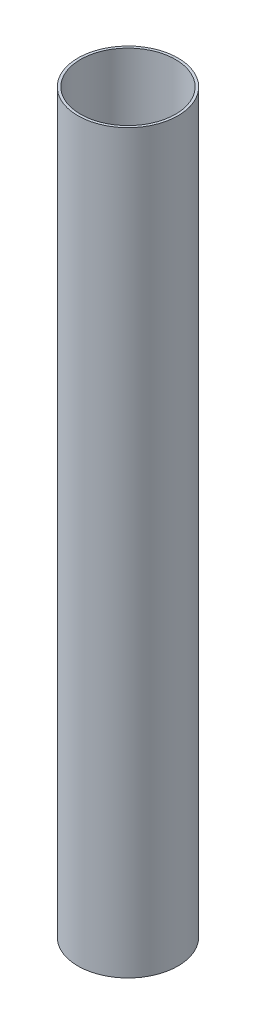
ISO-10303-21;
HEADER;
FILE_DESCRIPTION(('STEP AP214'),'2;1');
FILE_NAME('part.step','',(''),(''),'','','');
FILE_SCHEMA(('AUTOMOTIVE_DESIGN { 1 0 10303 214 1 1 1 1 }'));
ENDSEC;
DATA;
#1=APPLICATION_CONTEXT('core data for automotive mechanical design processes');
#2=APPLICATION_PROTOCOL_DEFINITION('international standard','automotive_design',2000,#1);
#3=PRODUCT_CONTEXT('',#1,'mechanical');
#4=PRODUCT('Part','Part','',(#3));
#5=PRODUCT_RELATED_PRODUCT_CATEGORY('part','',(#4));
#6=PRODUCT_DEFINITION_FORMATION('','',#4);
#7=PRODUCT_DEFINITION_CONTEXT('part definition',#1,'design');
#8=PRODUCT_DEFINITION('design','',#6,#7);
#9=PRODUCT_DEFINITION_SHAPE('','',#8);
#10=(LENGTH_UNIT() NAMED_UNIT(*) SI_UNIT(.MILLI.,.METRE.));
#11=(NAMED_UNIT(*) PLANE_ANGLE_UNIT() SI_UNIT($,.RADIAN.));
#12=(NAMED_UNIT(*) SI_UNIT($,.STERADIAN.) SOLID_ANGLE_UNIT());
#13=UNCERTAINTY_MEASURE_WITH_UNIT(LENGTH_MEASURE(1.E-05),#10,'distance_accuracy_value','');
#14=(GEOMETRIC_REPRESENTATION_CONTEXT(3) GLOBAL_UNCERTAINTY_ASSIGNED_CONTEXT((#13)) GLOBAL_UNIT_ASSIGNED_CONTEXT((#10,
#11,#12)) REPRESENTATION_CONTEXT('',''));
#15=CARTESIAN_POINT('',(0.,0.,0.));
#16=DIRECTION('',(0.,0.,1.));
#17=DIRECTION('',(1.,0.,0.));
#18=AXIS2_PLACEMENT_3D('',#15,#16,#17);
#19=CARTESIAN_POINT('',(0.,500.,0.));
#20=DIRECTION('',(0.,1.,0.));
#21=DIRECTION('',(0.,0.,1.));
#22=AXIS2_PLACEMENT_3D('',#19,#20,#21);
#23=PLANE('',#22);
#24=CARTESIAN_POINT('',(0.,500.,0.));
#25=DIRECTION('',(0.,1.,0.));
#26=DIRECTION('',(0.,0.,1.));
#27=AXIS2_PLACEMENT_3D('',#24,#25,#26);
#28=CIRCLE('',#27,33.9725);
#29=CARTESIAN_POINT('',(0.,500.,33.9725));
#30=VERTEX_POINT('',#29);
#31=EDGE_CURVE('E10',#30,#30,#28,.T.);
#32=ORIENTED_EDGE('',*,*,#31,.T.);
#33=EDGE_LOOP('',(#32));
#34=FACE_BOUND('',#33,.T.);
#35=CARTESIAN_POINT('',(0.,500.,0.));
#36=DIRECTION('',(0.,1.,0.));
#37=DIRECTION('',(0.,0.,1.));
#38=AXIS2_PLACEMENT_3D('',#35,#36,#37);
#39=CIRCLE('',#38,32.258);
#40=CARTESIAN_POINT('',(0.,500.,32.258));
#41=VERTEX_POINT('',#40);
#42=EDGE_CURVE('E50',#41,#41,#39,.T.);
#43=ORIENTED_EDGE('',*,*,#42,.F.);
#44=EDGE_LOOP('',(#43));
#45=FACE_BOUND('',#44,.T.);
#46=ADVANCED_FACE('F37',(#34,#45),#23,.T.);
#47=CARTESIAN_POINT('',(0.,0.,0.));
#48=DIRECTION('',(0.,1.,0.));
#49=DIRECTION('',(0.,0.,1.));
#50=AXIS2_PLACEMENT_3D('',#47,#48,#49);
#51=PLANE('',#50);
#52=CARTESIAN_POINT('',(0.,0.,0.));
#53=DIRECTION('',(0.,1.,0.));
#54=DIRECTION('',(0.,0.,1.));
#55=AXIS2_PLACEMENT_3D('',#52,#53,#54);
#56=CIRCLE('',#55,33.9725);
#57=CARTESIAN_POINT('',(0.,0.,33.9725));
#58=VERTEX_POINT('',#57);
#59=EDGE_CURVE('E41',#58,#58,#56,.T.);
#60=ORIENTED_EDGE('',*,*,#59,.F.);
#61=EDGE_LOOP('',(#60));
#62=FACE_BOUND('',#61,.T.);
#63=CARTESIAN_POINT('',(0.,0.,0.));
#64=DIRECTION('',(0.,1.,0.));
#65=DIRECTION('',(0.,0.,1.));
#66=AXIS2_PLACEMENT_3D('',#63,#64,#65);
#67=CIRCLE('',#66,32.258);
#68=CARTESIAN_POINT('',(0.,0.,32.258));
#69=VERTEX_POINT('',#68);
#70=EDGE_CURVE('E52',#69,#69,#67,.T.);
#71=ORIENTED_EDGE('',*,*,#70,.T.);
#72=EDGE_LOOP('',(#71));
#73=FACE_BOUND('',#72,.T.);
#74=ADVANCED_FACE('F64',(#62,#73),#51,.F.);
#75=CARTESIAN_POINT('',(0.,500.,0.));
#76=DIRECTION('',(0.,-1.,0.));
#77=DIRECTION('',(0.,0.,-1.));
#78=AXIS2_PLACEMENT_3D('',#75,#76,#77);
#79=CYLINDRICAL_SURFACE('',#78,33.9725);
#80=ORIENTED_EDGE('',*,*,#31,.F.);
#81=EDGE_LOOP('',(#80));
#82=FACE_BOUND('',#81,.T.);
#83=ORIENTED_EDGE('',*,*,#59,.T.);
#84=EDGE_LOOP('',(#83));
#85=FACE_BOUND('',#84,.T.);
#86=ADVANCED_FACE('F39',(#82,#85),#79,.T.);
#87=CARTESIAN_POINT('',(0.,500.,0.));
#88=DIRECTION('',(0.,-1.,0.));
#89=DIRECTION('',(0.,0.,-1.));
#90=AXIS2_PLACEMENT_3D('',#87,#88,#89);
#91=CYLINDRICAL_SURFACE('',#90,32.258);
#92=ORIENTED_EDGE('',*,*,#42,.T.);
#93=EDGE_LOOP('',(#92));
#94=FACE_BOUND('',#93,.T.);
#95=ORIENTED_EDGE('',*,*,#70,.F.);
#96=EDGE_LOOP('',(#95));
#97=FACE_BOUND('',#96,.T.);
#98=ADVANCED_FACE('F60',(#94,#97),#91,.F.);
#99=CLOSED_SHELL('',(#46,#74,#86,#98));
#100=MANIFOLD_SOLID_BREP('B2',#99);
#101=ADVANCED_BREP_SHAPE_REPRESENTATION('',(#18,#100),#14);
#102=SHAPE_DEFINITION_REPRESENTATION(#9,#101);
ENDSEC;
END-ISO-10303-21;
